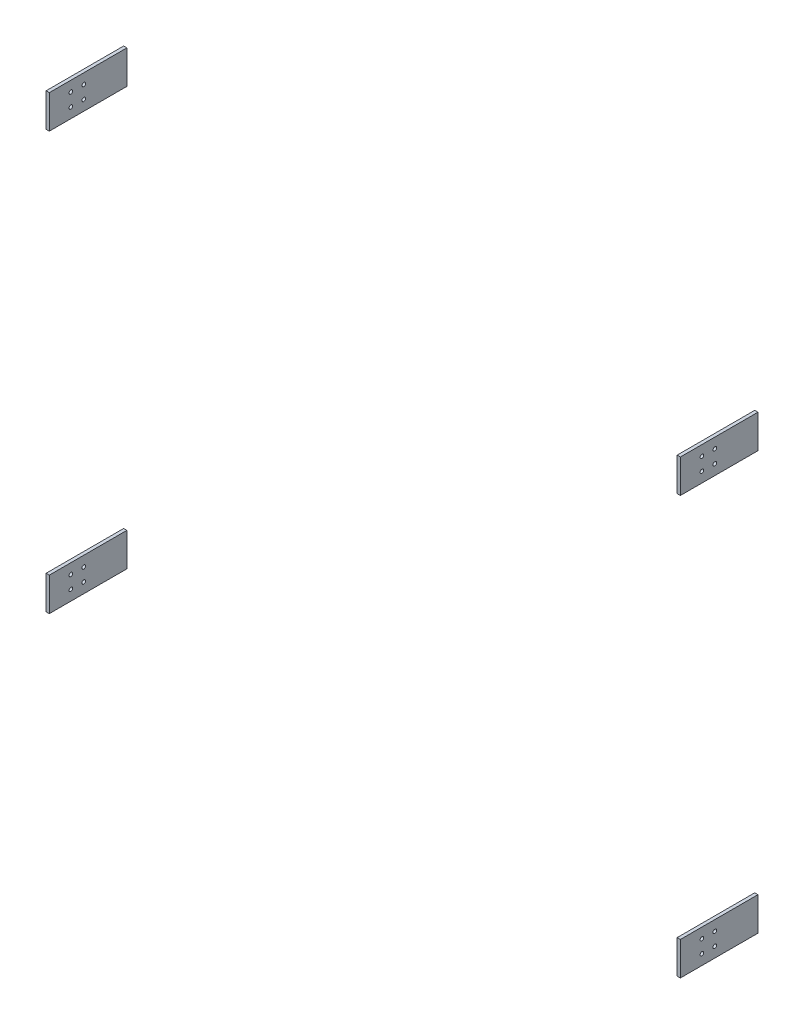
ISO-10303-21;
HEADER;
FILE_DESCRIPTION(('STEP AP214'),'2;1');
FILE_NAME('part.step','',(''),(''),'','','');
FILE_SCHEMA(('AUTOMOTIVE_DESIGN { 1 0 10303 214 1 1 1 1 }'));
ENDSEC;
DATA;
#1=APPLICATION_CONTEXT('core data for automotive mechanical design processes');
#2=APPLICATION_PROTOCOL_DEFINITION('international standard','automotive_design',2000,#1);
#3=PRODUCT_CONTEXT('',#1,'mechanical');
#4=PRODUCT('Part','Part','',(#3));
#5=PRODUCT_RELATED_PRODUCT_CATEGORY('part','',(#4));
#6=PRODUCT_DEFINITION_FORMATION('','',#4);
#7=PRODUCT_DEFINITION_CONTEXT('part definition',#1,'design');
#8=PRODUCT_DEFINITION('design','',#6,#7);
#9=PRODUCT_DEFINITION_SHAPE('','',#8);
#10=(LENGTH_UNIT() NAMED_UNIT(*) SI_UNIT(.MILLI.,.METRE.));
#11=(NAMED_UNIT(*) PLANE_ANGLE_UNIT() SI_UNIT($,.RADIAN.));
#12=(NAMED_UNIT(*) SI_UNIT($,.STERADIAN.) SOLID_ANGLE_UNIT());
#13=UNCERTAINTY_MEASURE_WITH_UNIT(LENGTH_MEASURE(1.E-05),#10,'distance_accuracy_value','');
#14=(GEOMETRIC_REPRESENTATION_CONTEXT(3) GLOBAL_UNCERTAINTY_ASSIGNED_CONTEXT((#13)) GLOBAL_UNIT_ASSIGNED_CONTEXT((#10,
#11,#12)) REPRESENTATION_CONTEXT('',''));
#15=CARTESIAN_POINT('',(0.,0.,0.));
#16=DIRECTION('',(0.,0.,1.));
#17=DIRECTION('',(1.,0.,0.));
#18=AXIS2_PLACEMENT_3D('',#15,#16,#17);
#19=CARTESIAN_POINT('',(-293.,-194.,14.));
#20=DIRECTION('',(0.,0.,1.));
#21=DIRECTION('',(1.,0.,0.));
#22=AXIS2_PLACEMENT_3D('',#19,#20,#21);
#23=PLANE('',#22);
#24=DIRECTION('',(-1.,0.,0.));
#25=VECTOR('',#24,1.);
#26=CARTESIAN_POINT('',(-293.,-209.5,14.));
#27=LINE('',#26,#25);
#28=CARTESIAN_POINT('',(-291.5,-209.5,14.));
#29=VERTEX_POINT('',#28);
#30=CARTESIAN_POINT('',(-294.5,-209.5,14.));
#31=VERTEX_POINT('',#30);
#32=EDGE_CURVE('P0_E11',#29,#31,#27,.T.);
#33=ORIENTED_EDGE('',*,*,#32,.F.);
#34=DIRECTION('',(0.,-1.,0.));
#35=VECTOR('',#34,1.);
#36=CARTESIAN_POINT('',(-291.5,-194.,14.));
#37=LINE('',#36,#35);
#38=CARTESIAN_POINT('',(-291.5,-178.5,14.));
#39=VERTEX_POINT('',#38);
#40=EDGE_CURVE('P0_E64',#39,#29,#37,.T.);
#41=ORIENTED_EDGE('',*,*,#40,.F.);
#42=DIRECTION('',(1.,0.,0.));
#43=VECTOR('',#42,1.);
#44=CARTESIAN_POINT('',(-293.,-178.5,14.));
#45=LINE('',#44,#43);
#46=CARTESIAN_POINT('',(-294.5,-178.5,14.));
#47=VERTEX_POINT('',#46);
#48=EDGE_CURVE('P0_E104',#47,#39,#45,.T.);
#49=ORIENTED_EDGE('',*,*,#48,.F.);
#50=DIRECTION('',(0.,1.,0.));
#51=VECTOR('',#50,1.);
#52=CARTESIAN_POINT('',(-294.5,-194.,14.));
#53=LINE('',#52,#51);
#54=EDGE_CURVE('P0_E26',#31,#47,#53,.T.);
#55=ORIENTED_EDGE('',*,*,#54,.F.);
#56=EDGE_LOOP('',(#33,#41,#49,#55));
#57=FACE_BOUND('',#56,.T.);
#58=ADVANCED_FACE('P0_F17',(#57),#23,.T.);
#59=CARTESIAN_POINT('',(-293.,-209.5,-58.));
#60=DIRECTION('',(0.,-1.,0.));
#61=DIRECTION('',(0.,0.,-1.));
#62=AXIS2_PLACEMENT_3D('',#59,#60,#61);
#63=PLANE('',#62);
#64=DIRECTION('',(0.,0.,1.));
#65=VECTOR('',#64,1.);
#66=CARTESIAN_POINT('',(-291.5,-209.5,-58.));
#67=LINE('',#66,#65);
#68=CARTESIAN_POINT('',(-291.5,-209.5,-58.));
#69=VERTEX_POINT('',#68);
#70=EDGE_CURVE('P0_E57',#69,#29,#67,.T.);
#71=ORIENTED_EDGE('',*,*,#70,.T.);
#72=ORIENTED_EDGE('',*,*,#32,.T.);
#73=DIRECTION('',(0.,0.,1.));
#74=VECTOR('',#73,1.);
#75=CARTESIAN_POINT('',(-294.5,-209.5,-58.));
#76=LINE('',#75,#74);
#77=CARTESIAN_POINT('',(-294.5,-209.5,-58.));
#78=VERTEX_POINT('',#77);
#79=EDGE_CURVE('P0_E71',#78,#31,#76,.T.);
#80=ORIENTED_EDGE('',*,*,#79,.F.);
#81=DIRECTION('',(1.,0.,0.));
#82=VECTOR('',#81,1.);
#83=CARTESIAN_POINT('',(-293.,-209.5,-58.));
#84=LINE('',#83,#82);
#85=EDGE_CURVE('P0_E69',#78,#69,#84,.T.);
#86=ORIENTED_EDGE('',*,*,#85,.T.);
#87=EDGE_LOOP('',(#71,#72,#80,#86));
#88=FACE_BOUND('',#87,.T.);
#89=ADVANCED_FACE('P0_F70',(#88),#63,.T.);
#90=CARTESIAN_POINT('',(-294.5,-194.,-58.));
#91=DIRECTION('',(-1.,0.,0.));
#92=DIRECTION('',(0.,0.,1.));
#93=AXIS2_PLACEMENT_3D('',#90,#91,#92);
#94=PLANE('',#93);
#95=CARTESIAN_POINT('',(-294.5,-188.,-6.));
#96=DIRECTION('',(-1.,0.,0.));
#97=DIRECTION('',(0.,0.,1.));
#98=AXIS2_PLACEMENT_3D('',#95,#96,#97);
#99=CIRCLE('',#98,1.7);
#100=CARTESIAN_POINT('',(-294.5,-188.,-4.3));
#101=VERTEX_POINT('',#100);
#102=EDGE_CURVE('P0_E121',#101,#101,#99,.T.);
#103=ORIENTED_EDGE('',*,*,#102,.F.);
#104=EDGE_LOOP('',(#103));
#105=FACE_BOUND('',#104,.T.);
#106=CARTESIAN_POINT('',(-294.5,-188.,-18.));
#107=DIRECTION('',(-1.,0.,0.));
#108=DIRECTION('',(0.,0.,1.));
#109=AXIS2_PLACEMENT_3D('',#106,#107,#108);
#110=CIRCLE('',#109,1.7);
#111=CARTESIAN_POINT('',(-294.5,-188.,-16.3));
#112=VERTEX_POINT('',#111);
#113=EDGE_CURVE('P0_E117',#112,#112,#110,.T.);
#114=ORIENTED_EDGE('',*,*,#113,.F.);
#115=EDGE_LOOP('',(#114));
#116=FACE_BOUND('',#115,.T.);
#117=CARTESIAN_POINT('',(-294.5,-200.,-6.));
#118=DIRECTION('',(-1.,0.,0.));
#119=DIRECTION('',(0.,0.,1.));
#120=AXIS2_PLACEMENT_3D('',#117,#118,#119);
#121=CIRCLE('',#120,1.7);
#122=CARTESIAN_POINT('',(-294.5,-200.,-4.3));
#123=VERTEX_POINT('',#122);
#124=EDGE_CURVE('P0_E113',#123,#123,#121,.T.);
#125=ORIENTED_EDGE('',*,*,#124,.F.);
#126=EDGE_LOOP('',(#125));
#127=FACE_BOUND('',#126,.T.);
#128=CARTESIAN_POINT('',(-294.5,-200.,-18.));
#129=DIRECTION('',(-1.,0.,0.));
#130=DIRECTION('',(0.,0.,1.));
#131=AXIS2_PLACEMENT_3D('',#128,#129,#130);
#132=CIRCLE('',#131,1.7);
#133=CARTESIAN_POINT('',(-294.5,-200.,-16.3));
#134=VERTEX_POINT('',#133);
#135=EDGE_CURVE('P0_E77',#134,#134,#132,.T.);
#136=ORIENTED_EDGE('',*,*,#135,.F.);
#137=EDGE_LOOP('',(#136));
#138=FACE_BOUND('',#137,.T.);
#139=ORIENTED_EDGE('',*,*,#79,.T.);
#140=ORIENTED_EDGE('',*,*,#54,.T.);
#141=DIRECTION('',(0.,0.,1.));
#142=VECTOR('',#141,1.);
#143=CARTESIAN_POINT('',(-294.5,-178.5,-58.));
#144=LINE('',#143,#142);
#145=CARTESIAN_POINT('',(-294.5,-178.5,-58.));
#146=VERTEX_POINT('',#145);
#147=EDGE_CURVE('P0_E96',#146,#47,#144,.T.);
#148=ORIENTED_EDGE('',*,*,#147,.F.);
#149=DIRECTION('',(0.,-1.,0.));
#150=VECTOR('',#149,1.);
#151=CARTESIAN_POINT('',(-294.5,-194.,-58.));
#152=LINE('',#151,#150);
#153=EDGE_CURVE('P0_E76',#146,#78,#152,.T.);
#154=ORIENTED_EDGE('',*,*,#153,.T.);
#155=EDGE_LOOP('',(#139,#140,#148,#154));
#156=FACE_BOUND('',#155,.T.);
#157=ADVANCED_FACE('P0_F142',(#105,#116,#127,#138,#156),#94,.T.);
#158=CARTESIAN_POINT('',(-293.,-178.5,-58.));
#159=DIRECTION('',(0.,1.,0.));
#160=DIRECTION('',(0.,0.,1.));
#161=AXIS2_PLACEMENT_3D('',#158,#159,#160);
#162=PLANE('',#161);
#163=ORIENTED_EDGE('',*,*,#147,.T.);
#164=ORIENTED_EDGE('',*,*,#48,.T.);
#165=DIRECTION('',(0.,0.,1.));
#166=VECTOR('',#165,1.);
#167=CARTESIAN_POINT('',(-291.5,-178.5,-58.));
#168=LINE('',#167,#166);
#169=CARTESIAN_POINT('',(-291.5,-178.5,-58.));
#170=VERTEX_POINT('',#169);
#171=EDGE_CURVE('P0_E66',#170,#39,#168,.T.);
#172=ORIENTED_EDGE('',*,*,#171,.F.);
#173=DIRECTION('',(-1.,0.,0.));
#174=VECTOR('',#173,1.);
#175=CARTESIAN_POINT('',(-293.,-178.5,-58.));
#176=LINE('',#175,#174);
#177=EDGE_CURVE('P0_E82',#170,#146,#176,.T.);
#178=ORIENTED_EDGE('',*,*,#177,.T.);
#179=EDGE_LOOP('',(#163,#164,#172,#178));
#180=FACE_BOUND('',#179,.T.);
#181=ADVANCED_FACE('P0_F144',(#180),#162,.T.);
#182=CARTESIAN_POINT('',(-293.,-194.,-58.));
#183=DIRECTION('',(0.,0.,-1.));
#184=DIRECTION('',(-1.,0.,0.));
#185=AXIS2_PLACEMENT_3D('',#182,#183,#184);
#186=PLANE('',#185);
#187=DIRECTION('',(0.,1.,0.));
#188=VECTOR('',#187,1.);
#189=CARTESIAN_POINT('',(-291.5,-194.,-58.));
#190=LINE('',#189,#188);
#191=EDGE_CURVE('P0_E62',#69,#170,#190,.T.);
#192=ORIENTED_EDGE('',*,*,#191,.F.);
#193=ORIENTED_EDGE('',*,*,#85,.F.);
#194=ORIENTED_EDGE('',*,*,#153,.F.);
#195=ORIENTED_EDGE('',*,*,#177,.F.);
#196=EDGE_LOOP('',(#192,#193,#194,#195));
#197=FACE_BOUND('',#196,.T.);
#198=ADVANCED_FACE('P0_F80',(#197),#186,.T.);
#199=CARTESIAN_POINT('',(-291.5,-194.,-58.));
#200=DIRECTION('',(1.,0.,0.));
#201=DIRECTION('',(0.,0.,-1.));
#202=AXIS2_PLACEMENT_3D('',#199,#200,#201);
#203=PLANE('',#202);
#204=CARTESIAN_POINT('',(-291.5,-188.,-6.));
#205=DIRECTION('',(1.,0.,0.));
#206=DIRECTION('',(0.,0.,-1.));
#207=AXIS2_PLACEMENT_3D('',#204,#205,#206);
#208=CIRCLE('',#207,1.7);
#209=CARTESIAN_POINT('',(-291.5,-188.,-7.7));
#210=VERTEX_POINT('',#209);
#211=EDGE_CURVE('P0_E20',#210,#210,#208,.T.);
#212=ORIENTED_EDGE('',*,*,#211,.F.);
#213=EDGE_LOOP('',(#212));
#214=FACE_BOUND('',#213,.T.);
#215=CARTESIAN_POINT('',(-291.5,-188.,-18.));
#216=DIRECTION('',(1.,0.,0.));
#217=DIRECTION('',(0.,0.,-1.));
#218=AXIS2_PLACEMENT_3D('',#215,#216,#217);
#219=CIRCLE('',#218,1.7);
#220=CARTESIAN_POINT('',(-291.5,-188.,-19.7));
#221=VERTEX_POINT('',#220);
#222=EDGE_CURVE('P0_E118',#221,#221,#219,.T.);
#223=ORIENTED_EDGE('',*,*,#222,.F.);
#224=EDGE_LOOP('',(#223));
#225=FACE_BOUND('',#224,.T.);
#226=CARTESIAN_POINT('',(-291.5,-200.,-6.));
#227=DIRECTION('',(1.,0.,0.));
#228=DIRECTION('',(0.,0.,-1.));
#229=AXIS2_PLACEMENT_3D('',#226,#227,#228);
#230=CIRCLE('',#229,1.7);
#231=CARTESIAN_POINT('',(-291.5,-200.,-7.7));
#232=VERTEX_POINT('',#231);
#233=EDGE_CURVE('P0_E114',#232,#232,#230,.T.);
#234=ORIENTED_EDGE('',*,*,#233,.F.);
#235=EDGE_LOOP('',(#234));
#236=FACE_BOUND('',#235,.T.);
#237=CARTESIAN_POINT('',(-291.5,-200.,-18.));
#238=DIRECTION('',(1.,0.,0.));
#239=DIRECTION('',(0.,0.,-1.));
#240=AXIS2_PLACEMENT_3D('',#237,#238,#239);
#241=CIRCLE('',#240,1.7);
#242=CARTESIAN_POINT('',(-291.5,-200.,-19.7));
#243=VERTEX_POINT('',#242);
#244=EDGE_CURVE('P0_E109',#243,#243,#241,.T.);
#245=ORIENTED_EDGE('',*,*,#244,.F.);
#246=EDGE_LOOP('',(#245));
#247=FACE_BOUND('',#246,.T.);
#248=ORIENTED_EDGE('',*,*,#191,.T.);
#249=ORIENTED_EDGE('',*,*,#171,.T.);
#250=ORIENTED_EDGE('',*,*,#40,.T.);
#251=ORIENTED_EDGE('',*,*,#70,.F.);
#252=EDGE_LOOP('',(#248,#249,#250,#251));
#253=FACE_BOUND('',#252,.T.);
#254=ADVANCED_FACE('P0_F59',(#214,#225,#236,#247,#253),#203,.T.);
#255=CARTESIAN_POINT('',(-291.2,-200.,-18.));
#256=DIRECTION('',(-1.,0.,0.));
#257=DIRECTION('',(0.,0.,1.));
#258=AXIS2_PLACEMENT_3D('',#255,#256,#257);
#259=CYLINDRICAL_SURFACE('',#258,1.7);
#260=ORIENTED_EDGE('',*,*,#135,.T.);
#261=EDGE_LOOP('',(#260));
#262=FACE_BOUND('',#261,.T.);
#263=ORIENTED_EDGE('',*,*,#244,.T.);
#264=EDGE_LOOP('',(#263));
#265=FACE_BOUND('',#264,.T.);
#266=ADVANCED_FACE('P0_F139',(#262,#265),#259,.F.);
#267=CARTESIAN_POINT('',(-291.2,-200.,-6.));
#268=DIRECTION('',(-1.,0.,0.));
#269=DIRECTION('',(0.,0.,1.));
#270=AXIS2_PLACEMENT_3D('',#267,#268,#269);
#271=CYLINDRICAL_SURFACE('',#270,1.7);
#272=ORIENTED_EDGE('',*,*,#124,.T.);
#273=EDGE_LOOP('',(#272));
#274=FACE_BOUND('',#273,.T.);
#275=ORIENTED_EDGE('',*,*,#233,.T.);
#276=EDGE_LOOP('',(#275));
#277=FACE_BOUND('',#276,.T.);
#278=ADVANCED_FACE('P0_F164',(#274,#277),#271,.F.);
#279=CARTESIAN_POINT('',(-291.2,-188.,-18.));
#280=DIRECTION('',(-1.,0.,0.));
#281=DIRECTION('',(0.,0.,1.));
#282=AXIS2_PLACEMENT_3D('',#279,#280,#281);
#283=CYLINDRICAL_SURFACE('',#282,1.7);
#284=ORIENTED_EDGE('',*,*,#113,.T.);
#285=EDGE_LOOP('',(#284));
#286=FACE_BOUND('',#285,.T.);
#287=ORIENTED_EDGE('',*,*,#222,.T.);
#288=EDGE_LOOP('',(#287));
#289=FACE_BOUND('',#288,.T.);
#290=ADVANCED_FACE('P0_F167',(#286,#289),#283,.F.);
#291=CARTESIAN_POINT('',(-291.2,-188.,-6.));
#292=DIRECTION('',(-1.,0.,0.));
#293=DIRECTION('',(0.,0.,1.));
#294=AXIS2_PLACEMENT_3D('',#291,#292,#293);
#295=CYLINDRICAL_SURFACE('',#294,1.7);
#296=ORIENTED_EDGE('',*,*,#102,.T.);
#297=EDGE_LOOP('',(#296));
#298=FACE_BOUND('',#297,.T.);
#299=ORIENTED_EDGE('',*,*,#211,.T.);
#300=EDGE_LOOP('',(#299));
#301=FACE_BOUND('',#300,.T.);
#302=ADVANCED_FACE('P0_F171',(#298,#301),#295,.F.);
#303=CLOSED_SHELL('',(#58,#89,#157,#181,#198,#254,#266,#278,#290,#302));
#304=MANIFOLD_SOLID_BREP('P0_B1',#303);
#305=CARTESIAN_POINT('',(-293.,194.,14.));
#306=DIRECTION('',(0.,0.,1.));
#307=DIRECTION('',(1.,0.,0.));
#308=AXIS2_PLACEMENT_3D('',#305,#306,#307);
#309=PLANE('',#308);
#310=DIRECTION('',(-1.,0.,0.));
#311=VECTOR('',#310,1.);
#312=CARTESIAN_POINT('',(-293.,178.5,14.));
#313=LINE('',#312,#311);
#314=CARTESIAN_POINT('',(-291.5,178.5,14.));
#315=VERTEX_POINT('',#314);
#316=CARTESIAN_POINT('',(-294.5,178.5,14.));
#317=VERTEX_POINT('',#316);
#318=EDGE_CURVE('P1_E11',#315,#317,#313,.T.);
#319=ORIENTED_EDGE('',*,*,#318,.F.);
#320=DIRECTION('',(0.,-1.,0.));
#321=VECTOR('',#320,1.);
#322=CARTESIAN_POINT('',(-291.5,194.,14.));
#323=LINE('',#322,#321);
#324=CARTESIAN_POINT('',(-291.5,209.5,14.));
#325=VERTEX_POINT('',#324);
#326=EDGE_CURVE('P1_E64',#325,#315,#323,.T.);
#327=ORIENTED_EDGE('',*,*,#326,.F.);
#328=DIRECTION('',(1.,0.,0.));
#329=VECTOR('',#328,1.);
#330=CARTESIAN_POINT('',(-293.,209.5,14.));
#331=LINE('',#330,#329);
#332=CARTESIAN_POINT('',(-294.5,209.5,14.));
#333=VERTEX_POINT('',#332);
#334=EDGE_CURVE('P1_E103',#333,#325,#331,.T.);
#335=ORIENTED_EDGE('',*,*,#334,.F.);
#336=DIRECTION('',(0.,1.,0.));
#337=VECTOR('',#336,1.);
#338=CARTESIAN_POINT('',(-294.5,194.,14.));
#339=LINE('',#338,#337);
#340=EDGE_CURVE('P1_E26',#317,#333,#339,.T.);
#341=ORIENTED_EDGE('',*,*,#340,.F.);
#342=EDGE_LOOP('',(#319,#327,#335,#341));
#343=FACE_BOUND('',#342,.T.);
#344=ADVANCED_FACE('P1_F17',(#343),#309,.T.);
#345=CARTESIAN_POINT('',(-293.,178.5,-58.));
#346=DIRECTION('',(0.,-1.,0.));
#347=DIRECTION('',(0.,0.,-1.));
#348=AXIS2_PLACEMENT_3D('',#345,#346,#347);
#349=PLANE('',#348);
#350=DIRECTION('',(0.,0.,1.));
#351=VECTOR('',#350,1.);
#352=CARTESIAN_POINT('',(-291.5,178.5,-58.));
#353=LINE('',#352,#351);
#354=CARTESIAN_POINT('',(-291.5,178.5,-58.));
#355=VERTEX_POINT('',#354);
#356=EDGE_CURVE('P1_E57',#355,#315,#353,.T.);
#357=ORIENTED_EDGE('',*,*,#356,.T.);
#358=ORIENTED_EDGE('',*,*,#318,.T.);
#359=DIRECTION('',(0.,0.,1.));
#360=VECTOR('',#359,1.);
#361=CARTESIAN_POINT('',(-294.5,178.5,-58.));
#362=LINE('',#361,#360);
#363=CARTESIAN_POINT('',(-294.5,178.5,-58.));
#364=VERTEX_POINT('',#363);
#365=EDGE_CURVE('P1_E71',#364,#317,#362,.T.);
#366=ORIENTED_EDGE('',*,*,#365,.F.);
#367=DIRECTION('',(1.,0.,0.));
#368=VECTOR('',#367,1.);
#369=CARTESIAN_POINT('',(-293.,178.5,-58.));
#370=LINE('',#369,#368);
#371=EDGE_CURVE('P1_E69',#364,#355,#370,.T.);
#372=ORIENTED_EDGE('',*,*,#371,.T.);
#373=EDGE_LOOP('',(#357,#358,#366,#372));
#374=FACE_BOUND('',#373,.T.);
#375=ADVANCED_FACE('P1_F70',(#374),#349,.T.);
#376=CARTESIAN_POINT('',(-294.5,194.,-58.));
#377=DIRECTION('',(-1.,0.,0.));
#378=DIRECTION('',(0.,0.,1.));
#379=AXIS2_PLACEMENT_3D('',#376,#377,#378);
#380=PLANE('',#379);
#381=CARTESIAN_POINT('',(-294.5,200.,-6.));
#382=DIRECTION('',(-1.,0.,0.));
#383=DIRECTION('',(0.,0.,1.));
#384=AXIS2_PLACEMENT_3D('',#381,#382,#383);
#385=CIRCLE('',#384,1.7);
#386=CARTESIAN_POINT('',(-294.5,200.,-4.3));
#387=VERTEX_POINT('',#386);
#388=EDGE_CURVE('P1_E119',#387,#387,#385,.T.);
#389=ORIENTED_EDGE('',*,*,#388,.F.);
#390=EDGE_LOOP('',(#389));
#391=FACE_BOUND('',#390,.T.);
#392=CARTESIAN_POINT('',(-294.5,200.,-18.));
#393=DIRECTION('',(-1.,0.,0.));
#394=DIRECTION('',(0.,0.,1.));
#395=AXIS2_PLACEMENT_3D('',#392,#393,#394);
#396=CIRCLE('',#395,1.7);
#397=CARTESIAN_POINT('',(-294.5,200.,-16.3));
#398=VERTEX_POINT('',#397);
#399=EDGE_CURVE('P1_E115',#398,#398,#396,.T.);
#400=ORIENTED_EDGE('',*,*,#399,.F.);
#401=EDGE_LOOP('',(#400));
#402=FACE_BOUND('',#401,.T.);
#403=CARTESIAN_POINT('',(-294.5,188.,-6.));
#404=DIRECTION('',(-1.,0.,0.));
#405=DIRECTION('',(0.,0.,1.));
#406=AXIS2_PLACEMENT_3D('',#403,#404,#405);
#407=CIRCLE('',#406,1.7);
#408=CARTESIAN_POINT('',(-294.5,188.,-4.3));
#409=VERTEX_POINT('',#408);
#410=EDGE_CURVE('P1_E111',#409,#409,#407,.T.);
#411=ORIENTED_EDGE('',*,*,#410,.F.);
#412=EDGE_LOOP('',(#411));
#413=FACE_BOUND('',#412,.T.);
#414=CARTESIAN_POINT('',(-294.5,188.,-18.));
#415=DIRECTION('',(-1.,0.,0.));
#416=DIRECTION('',(0.,0.,1.));
#417=AXIS2_PLACEMENT_3D('',#414,#415,#416);
#418=CIRCLE('',#417,1.7);
#419=CARTESIAN_POINT('',(-294.5,188.,-16.3));
#420=VERTEX_POINT('',#419);
#421=EDGE_CURVE('P1_E77',#420,#420,#418,.T.);
#422=ORIENTED_EDGE('',*,*,#421,.F.);
#423=EDGE_LOOP('',(#422));
#424=FACE_BOUND('',#423,.T.);
#425=ORIENTED_EDGE('',*,*,#365,.T.);
#426=ORIENTED_EDGE('',*,*,#340,.T.);
#427=DIRECTION('',(0.,0.,1.));
#428=VECTOR('',#427,1.);
#429=CARTESIAN_POINT('',(-294.5,209.5,-58.));
#430=LINE('',#429,#428);
#431=CARTESIAN_POINT('',(-294.5,209.5,-58.));
#432=VERTEX_POINT('',#431);
#433=EDGE_CURVE('P1_E96',#432,#333,#430,.T.);
#434=ORIENTED_EDGE('',*,*,#433,.F.);
#435=DIRECTION('',(0.,-1.,0.));
#436=VECTOR('',#435,1.);
#437=CARTESIAN_POINT('',(-294.5,194.,-58.));
#438=LINE('',#437,#436);
#439=EDGE_CURVE('P1_E76',#432,#364,#438,.T.);
#440=ORIENTED_EDGE('',*,*,#439,.T.);
#441=EDGE_LOOP('',(#425,#426,#434,#440));
#442=FACE_BOUND('',#441,.T.);
#443=ADVANCED_FACE('P1_F142',(#391,#402,#413,#424,#442),#380,.T.);
#444=CARTESIAN_POINT('',(-293.,209.5,-58.));
#445=DIRECTION('',(0.,1.,0.));
#446=DIRECTION('',(0.,0.,1.));
#447=AXIS2_PLACEMENT_3D('',#444,#445,#446);
#448=PLANE('',#447);
#449=ORIENTED_EDGE('',*,*,#433,.T.);
#450=ORIENTED_EDGE('',*,*,#334,.T.);
#451=DIRECTION('',(0.,0.,1.));
#452=VECTOR('',#451,1.);
#453=CARTESIAN_POINT('',(-291.5,209.5,-58.));
#454=LINE('',#453,#452);
#455=CARTESIAN_POINT('',(-291.5,209.5,-58.));
#456=VERTEX_POINT('',#455);
#457=EDGE_CURVE('P1_E66',#456,#325,#454,.T.);
#458=ORIENTED_EDGE('',*,*,#457,.F.);
#459=DIRECTION('',(-1.,0.,0.));
#460=VECTOR('',#459,1.);
#461=CARTESIAN_POINT('',(-293.,209.5,-58.));
#462=LINE('',#461,#460);
#463=EDGE_CURVE('P1_E82',#456,#432,#462,.T.);
#464=ORIENTED_EDGE('',*,*,#463,.T.);
#465=EDGE_LOOP('',(#449,#450,#458,#464));
#466=FACE_BOUND('',#465,.T.);
#467=ADVANCED_FACE('P1_F144',(#466),#448,.T.);
#468=CARTESIAN_POINT('',(-293.,194.,-58.));
#469=DIRECTION('',(0.,0.,-1.));
#470=DIRECTION('',(-1.,0.,0.));
#471=AXIS2_PLACEMENT_3D('',#468,#469,#470);
#472=PLANE('',#471);
#473=DIRECTION('',(0.,1.,0.));
#474=VECTOR('',#473,1.);
#475=CARTESIAN_POINT('',(-291.5,194.,-58.));
#476=LINE('',#475,#474);
#477=EDGE_CURVE('P1_E62',#355,#456,#476,.T.);
#478=ORIENTED_EDGE('',*,*,#477,.F.);
#479=ORIENTED_EDGE('',*,*,#371,.F.);
#480=ORIENTED_EDGE('',*,*,#439,.F.);
#481=ORIENTED_EDGE('',*,*,#463,.F.);
#482=EDGE_LOOP('',(#478,#479,#480,#481));
#483=FACE_BOUND('',#482,.T.);
#484=ADVANCED_FACE('P1_F80',(#483),#472,.T.);
#485=CARTESIAN_POINT('',(-291.5,194.,-58.));
#486=DIRECTION('',(1.,0.,0.));
#487=DIRECTION('',(0.,0.,-1.));
#488=AXIS2_PLACEMENT_3D('',#485,#486,#487);
#489=PLANE('',#488);
#490=CARTESIAN_POINT('',(-291.5,200.,-6.));
#491=DIRECTION('',(1.,0.,0.));
#492=DIRECTION('',(0.,0.,-1.));
#493=AXIS2_PLACEMENT_3D('',#490,#491,#492);
#494=CIRCLE('',#493,1.7);
#495=CARTESIAN_POINT('',(-291.5,200.,-7.7));
#496=VERTEX_POINT('',#495);
#497=EDGE_CURVE('P1_E20',#496,#496,#494,.T.);
#498=ORIENTED_EDGE('',*,*,#497,.F.);
#499=EDGE_LOOP('',(#498));
#500=FACE_BOUND('',#499,.T.);
#501=CARTESIAN_POINT('',(-291.5,200.,-18.));
#502=DIRECTION('',(1.,0.,0.));
#503=DIRECTION('',(0.,0.,-1.));
#504=AXIS2_PLACEMENT_3D('',#501,#502,#503);
#505=CIRCLE('',#504,1.7);
#506=CARTESIAN_POINT('',(-291.5,200.,-19.7));
#507=VERTEX_POINT('',#506);
#508=EDGE_CURVE('P1_E116',#507,#507,#505,.T.);
#509=ORIENTED_EDGE('',*,*,#508,.F.);
#510=EDGE_LOOP('',(#509));
#511=FACE_BOUND('',#510,.T.);
#512=CARTESIAN_POINT('',(-291.5,188.,-6.));
#513=DIRECTION('',(1.,0.,0.));
#514=DIRECTION('',(0.,0.,-1.));
#515=AXIS2_PLACEMENT_3D('',#512,#513,#514);
#516=CIRCLE('',#515,1.7);
#517=CARTESIAN_POINT('',(-291.5,188.,-7.7));
#518=VERTEX_POINT('',#517);
#519=EDGE_CURVE('P1_E112',#518,#518,#516,.T.);
#520=ORIENTED_EDGE('',*,*,#519,.F.);
#521=EDGE_LOOP('',(#520));
#522=FACE_BOUND('',#521,.T.);
#523=CARTESIAN_POINT('',(-291.5,188.,-18.));
#524=DIRECTION('',(1.,0.,0.));
#525=DIRECTION('',(0.,0.,-1.));
#526=AXIS2_PLACEMENT_3D('',#523,#524,#525);
#527=CIRCLE('',#526,1.7);
#528=CARTESIAN_POINT('',(-291.5,188.,-19.7));
#529=VERTEX_POINT('',#528);
#530=EDGE_CURVE('P1_E107',#529,#529,#527,.T.);
#531=ORIENTED_EDGE('',*,*,#530,.F.);
#532=EDGE_LOOP('',(#531));
#533=FACE_BOUND('',#532,.T.);
#534=ORIENTED_EDGE('',*,*,#477,.T.);
#535=ORIENTED_EDGE('',*,*,#457,.T.);
#536=ORIENTED_EDGE('',*,*,#326,.T.);
#537=ORIENTED_EDGE('',*,*,#356,.F.);
#538=EDGE_LOOP('',(#534,#535,#536,#537));
#539=FACE_BOUND('',#538,.T.);
#540=ADVANCED_FACE('P1_F59',(#500,#511,#522,#533,#539),#489,.T.);
#541=CARTESIAN_POINT('',(-291.2,188.,-18.));
#542=DIRECTION('',(-1.,0.,0.));
#543=DIRECTION('',(0.,0.,1.));
#544=AXIS2_PLACEMENT_3D('',#541,#542,#543);
#545=CYLINDRICAL_SURFACE('',#544,1.7);
#546=ORIENTED_EDGE('',*,*,#421,.T.);
#547=EDGE_LOOP('',(#546));
#548=FACE_BOUND('',#547,.T.);
#549=ORIENTED_EDGE('',*,*,#530,.T.);
#550=EDGE_LOOP('',(#549));
#551=FACE_BOUND('',#550,.T.);
#552=ADVANCED_FACE('P1_F139',(#548,#551),#545,.F.);
#553=CARTESIAN_POINT('',(-291.2,188.,-6.));
#554=DIRECTION('',(-1.,0.,0.));
#555=DIRECTION('',(0.,0.,1.));
#556=AXIS2_PLACEMENT_3D('',#553,#554,#555);
#557=CYLINDRICAL_SURFACE('',#556,1.7);
#558=ORIENTED_EDGE('',*,*,#410,.T.);
#559=EDGE_LOOP('',(#558));
#560=FACE_BOUND('',#559,.T.);
#561=ORIENTED_EDGE('',*,*,#519,.T.);
#562=EDGE_LOOP('',(#561));
#563=FACE_BOUND('',#562,.T.);
#564=ADVANCED_FACE('P1_F164',(#560,#563),#557,.F.);
#565=CARTESIAN_POINT('',(-291.2,200.,-18.));
#566=DIRECTION('',(-1.,0.,0.));
#567=DIRECTION('',(0.,0.,1.));
#568=AXIS2_PLACEMENT_3D('',#565,#566,#567);
#569=CYLINDRICAL_SURFACE('',#568,1.7);
#570=ORIENTED_EDGE('',*,*,#399,.T.);
#571=EDGE_LOOP('',(#570));
#572=FACE_BOUND('',#571,.T.);
#573=ORIENTED_EDGE('',*,*,#508,.T.);
#574=EDGE_LOOP('',(#573));
#575=FACE_BOUND('',#574,.T.);
#576=ADVANCED_FACE('P1_F167',(#572,#575),#569,.F.);
#577=CARTESIAN_POINT('',(-291.2,200.,-6.));
#578=DIRECTION('',(-1.,0.,0.));
#579=DIRECTION('',(0.,0.,1.));
#580=AXIS2_PLACEMENT_3D('',#577,#578,#579);
#581=CYLINDRICAL_SURFACE('',#580,1.7);
#582=ORIENTED_EDGE('',*,*,#388,.T.);
#583=EDGE_LOOP('',(#582));
#584=FACE_BOUND('',#583,.T.);
#585=ORIENTED_EDGE('',*,*,#497,.T.);
#586=EDGE_LOOP('',(#585));
#587=FACE_BOUND('',#586,.T.);
#588=ADVANCED_FACE('P1_F171',(#584,#587),#581,.F.);
#589=CLOSED_SHELL('',(#344,#375,#443,#467,#484,#540,#552,#564,#576,#588));
#590=MANIFOLD_SOLID_BREP('P1_B1',#589);
#591=CARTESIAN_POINT('',(293.,-194.,14.));
#592=DIRECTION('',(0.,0.,1.));
#593=DIRECTION('',(1.,0.,0.));
#594=AXIS2_PLACEMENT_3D('',#591,#592,#593);
#595=PLANE('',#594);
#596=DIRECTION('',(-1.,0.,0.));
#597=VECTOR('',#596,1.);
#598=CARTESIAN_POINT('',(293.,-209.5,14.));
#599=LINE('',#598,#597);
#600=CARTESIAN_POINT('',(294.5,-209.5,14.));
#601=VERTEX_POINT('',#600);
#602=CARTESIAN_POINT('',(291.5,-209.5,14.));
#603=VERTEX_POINT('',#602);
#604=EDGE_CURVE('P2_E11',#601,#603,#599,.T.);
#605=ORIENTED_EDGE('',*,*,#604,.F.);
#606=DIRECTION('',(0.,-1.,0.));
#607=VECTOR('',#606,1.);
#608=CARTESIAN_POINT('',(294.5,-194.,14.));
#609=LINE('',#608,#607);
#610=CARTESIAN_POINT('',(294.5,-178.5,14.));
#611=VERTEX_POINT('',#610);
#612=EDGE_CURVE('P2_E64',#611,#601,#609,.T.);
#613=ORIENTED_EDGE('',*,*,#612,.F.);
#614=DIRECTION('',(1.,0.,0.));
#615=VECTOR('',#614,1.);
#616=CARTESIAN_POINT('',(293.,-178.5,14.));
#617=LINE('',#616,#615);
#618=CARTESIAN_POINT('',(291.5,-178.5,14.));
#619=VERTEX_POINT('',#618);
#620=EDGE_CURVE('P2_E102',#619,#611,#617,.T.);
#621=ORIENTED_EDGE('',*,*,#620,.F.);
#622=DIRECTION('',(0.,1.,0.));
#623=VECTOR('',#622,1.);
#624=CARTESIAN_POINT('',(291.5,-194.,14.));
#625=LINE('',#624,#623);
#626=EDGE_CURVE('P2_E26',#603,#619,#625,.T.);
#627=ORIENTED_EDGE('',*,*,#626,.F.);
#628=EDGE_LOOP('',(#605,#613,#621,#627));
#629=FACE_BOUND('',#628,.T.);
#630=ADVANCED_FACE('P2_F17',(#629),#595,.T.);
#631=CARTESIAN_POINT('',(293.,-209.5,-58.));
#632=DIRECTION('',(0.,-1.,0.));
#633=DIRECTION('',(0.,0.,-1.));
#634=AXIS2_PLACEMENT_3D('',#631,#632,#633);
#635=PLANE('',#634);
#636=DIRECTION('',(0.,0.,1.));
#637=VECTOR('',#636,1.);
#638=CARTESIAN_POINT('',(294.5,-209.5,-58.));
#639=LINE('',#638,#637);
#640=CARTESIAN_POINT('',(294.5,-209.5,-58.));
#641=VERTEX_POINT('',#640);
#642=EDGE_CURVE('P2_E57',#641,#601,#639,.T.);
#643=ORIENTED_EDGE('',*,*,#642,.T.);
#644=ORIENTED_EDGE('',*,*,#604,.T.);
#645=DIRECTION('',(0.,0.,1.));
#646=VECTOR('',#645,1.);
#647=CARTESIAN_POINT('',(291.5,-209.5,-58.));
#648=LINE('',#647,#646);
#649=CARTESIAN_POINT('',(291.5,-209.5,-58.));
#650=VERTEX_POINT('',#649);
#651=EDGE_CURVE('P2_E71',#650,#603,#648,.T.);
#652=ORIENTED_EDGE('',*,*,#651,.F.);
#653=DIRECTION('',(1.,0.,0.));
#654=VECTOR('',#653,1.);
#655=CARTESIAN_POINT('',(293.,-209.5,-58.));
#656=LINE('',#655,#654);
#657=EDGE_CURVE('P2_E69',#650,#641,#656,.T.);
#658=ORIENTED_EDGE('',*,*,#657,.T.);
#659=EDGE_LOOP('',(#643,#644,#652,#658));
#660=FACE_BOUND('',#659,.T.);
#661=ADVANCED_FACE('P2_F70',(#660),#635,.T.);
#662=CARTESIAN_POINT('',(291.5,-194.,-58.));
#663=DIRECTION('',(-1.,0.,0.));
#664=DIRECTION('',(0.,0.,1.));
#665=AXIS2_PLACEMENT_3D('',#662,#663,#664);
#666=PLANE('',#665);
#667=CARTESIAN_POINT('',(291.5,-188.,-6.));
#668=DIRECTION('',(-1.,0.,0.));
#669=DIRECTION('',(0.,0.,1.));
#670=AXIS2_PLACEMENT_3D('',#667,#668,#669);
#671=CIRCLE('',#670,1.7);
#672=CARTESIAN_POINT('',(291.5,-188.,-4.3));
#673=VERTEX_POINT('',#672);
#674=EDGE_CURVE('P2_E119',#673,#673,#671,.T.);
#675=ORIENTED_EDGE('',*,*,#674,.F.);
#676=EDGE_LOOP('',(#675));
#677=FACE_BOUND('',#676,.T.);
#678=CARTESIAN_POINT('',(291.5,-188.,-18.));
#679=DIRECTION('',(-1.,0.,0.));
#680=DIRECTION('',(0.,0.,1.));
#681=AXIS2_PLACEMENT_3D('',#678,#679,#680);
#682=CIRCLE('',#681,1.7);
#683=CARTESIAN_POINT('',(291.5,-188.,-16.3));
#684=VERTEX_POINT('',#683);
#685=EDGE_CURVE('P2_E115',#684,#684,#682,.T.);
#686=ORIENTED_EDGE('',*,*,#685,.F.);
#687=EDGE_LOOP('',(#686));
#688=FACE_BOUND('',#687,.T.);
#689=CARTESIAN_POINT('',(291.5,-200.,-6.));
#690=DIRECTION('',(-1.,0.,0.));
#691=DIRECTION('',(0.,0.,1.));
#692=AXIS2_PLACEMENT_3D('',#689,#690,#691);
#693=CIRCLE('',#692,1.7);
#694=CARTESIAN_POINT('',(291.5,-200.,-4.3));
#695=VERTEX_POINT('',#694);
#696=EDGE_CURVE('P2_E111',#695,#695,#693,.T.);
#697=ORIENTED_EDGE('',*,*,#696,.F.);
#698=EDGE_LOOP('',(#697));
#699=FACE_BOUND('',#698,.T.);
#700=CARTESIAN_POINT('',(291.5,-200.,-18.));
#701=DIRECTION('',(-1.,0.,0.));
#702=DIRECTION('',(0.,0.,1.));
#703=AXIS2_PLACEMENT_3D('',#700,#701,#702);
#704=CIRCLE('',#703,1.7);
#705=CARTESIAN_POINT('',(291.5,-200.,-16.3));
#706=VERTEX_POINT('',#705);
#707=EDGE_CURVE('P2_E77',#706,#706,#704,.T.);
#708=ORIENTED_EDGE('',*,*,#707,.F.);
#709=EDGE_LOOP('',(#708));
#710=FACE_BOUND('',#709,.T.);
#711=ORIENTED_EDGE('',*,*,#651,.T.);
#712=ORIENTED_EDGE('',*,*,#626,.T.);
#713=DIRECTION('',(0.,0.,1.));
#714=VECTOR('',#713,1.);
#715=CARTESIAN_POINT('',(291.5,-178.5,-58.));
#716=LINE('',#715,#714);
#717=CARTESIAN_POINT('',(291.5,-178.5,-58.));
#718=VERTEX_POINT('',#717);
#719=EDGE_CURVE('P2_E95',#718,#619,#716,.T.);
#720=ORIENTED_EDGE('',*,*,#719,.F.);
#721=DIRECTION('',(0.,-1.,0.));
#722=VECTOR('',#721,1.);
#723=CARTESIAN_POINT('',(291.5,-194.,-58.));
#724=LINE('',#723,#722);
#725=EDGE_CURVE('P2_E76',#718,#650,#724,.T.);
#726=ORIENTED_EDGE('',*,*,#725,.T.);
#727=EDGE_LOOP('',(#711,#712,#720,#726));
#728=FACE_BOUND('',#727,.T.);
#729=ADVANCED_FACE('P2_F142',(#677,#688,#699,#710,#728),#666,.T.);
#730=CARTESIAN_POINT('',(293.,-178.5,-58.));
#731=DIRECTION('',(0.,1.,0.));
#732=DIRECTION('',(0.,0.,1.));
#733=AXIS2_PLACEMENT_3D('',#730,#731,#732);
#734=PLANE('',#733);
#735=ORIENTED_EDGE('',*,*,#719,.T.);
#736=ORIENTED_EDGE('',*,*,#620,.T.);
#737=DIRECTION('',(0.,0.,1.));
#738=VECTOR('',#737,1.);
#739=CARTESIAN_POINT('',(294.5,-178.5,-58.));
#740=LINE('',#739,#738);
#741=CARTESIAN_POINT('',(294.5,-178.5,-58.));
#742=VERTEX_POINT('',#741);
#743=EDGE_CURVE('P2_E66',#742,#611,#740,.T.);
#744=ORIENTED_EDGE('',*,*,#743,.F.);
#745=DIRECTION('',(-1.,0.,0.));
#746=VECTOR('',#745,1.);
#747=CARTESIAN_POINT('',(293.,-178.5,-58.));
#748=LINE('',#747,#746);
#749=EDGE_CURVE('P2_E82',#742,#718,#748,.T.);
#750=ORIENTED_EDGE('',*,*,#749,.T.);
#751=EDGE_LOOP('',(#735,#736,#744,#750));
#752=FACE_BOUND('',#751,.T.);
#753=ADVANCED_FACE('P2_F144',(#752),#734,.T.);
#754=CARTESIAN_POINT('',(293.,-194.,-58.));
#755=DIRECTION('',(0.,0.,-1.));
#756=DIRECTION('',(-1.,0.,0.));
#757=AXIS2_PLACEMENT_3D('',#754,#755,#756);
#758=PLANE('',#757);
#759=DIRECTION('',(0.,1.,0.));
#760=VECTOR('',#759,1.);
#761=CARTESIAN_POINT('',(294.5,-194.,-58.));
#762=LINE('',#761,#760);
#763=EDGE_CURVE('P2_E62',#641,#742,#762,.T.);
#764=ORIENTED_EDGE('',*,*,#763,.F.);
#765=ORIENTED_EDGE('',*,*,#657,.F.);
#766=ORIENTED_EDGE('',*,*,#725,.F.);
#767=ORIENTED_EDGE('',*,*,#749,.F.);
#768=EDGE_LOOP('',(#764,#765,#766,#767));
#769=FACE_BOUND('',#768,.T.);
#770=ADVANCED_FACE('P2_F80',(#769),#758,.T.);
#771=CARTESIAN_POINT('',(294.5,-194.,-58.));
#772=DIRECTION('',(1.,0.,0.));
#773=DIRECTION('',(0.,0.,-1.));
#774=AXIS2_PLACEMENT_3D('',#771,#772,#773);
#775=PLANE('',#774);
#776=CARTESIAN_POINT('',(294.5,-188.,-6.));
#777=DIRECTION('',(1.,0.,0.));
#778=DIRECTION('',(0.,0.,-1.));
#779=AXIS2_PLACEMENT_3D('',#776,#777,#778);
#780=CIRCLE('',#779,1.7);
#781=CARTESIAN_POINT('',(294.5,-188.,-7.7));
#782=VERTEX_POINT('',#781);
#783=EDGE_CURVE('P2_E20',#782,#782,#780,.T.);
#784=ORIENTED_EDGE('',*,*,#783,.F.);
#785=EDGE_LOOP('',(#784));
#786=FACE_BOUND('',#785,.T.);
#787=CARTESIAN_POINT('',(294.5,-188.,-18.));
#788=DIRECTION('',(1.,0.,0.));
#789=DIRECTION('',(0.,0.,-1.));
#790=AXIS2_PLACEMENT_3D('',#787,#788,#789);
#791=CIRCLE('',#790,1.7);
#792=CARTESIAN_POINT('',(294.5,-188.,-19.7));
#793=VERTEX_POINT('',#792);
#794=EDGE_CURVE('P2_E116',#793,#793,#791,.T.);
#795=ORIENTED_EDGE('',*,*,#794,.F.);
#796=EDGE_LOOP('',(#795));
#797=FACE_BOUND('',#796,.T.);
#798=CARTESIAN_POINT('',(294.5,-200.,-6.));
#799=DIRECTION('',(1.,0.,0.));
#800=DIRECTION('',(0.,0.,-1.));
#801=AXIS2_PLACEMENT_3D('',#798,#799,#800);
#802=CIRCLE('',#801,1.7);
#803=CARTESIAN_POINT('',(294.5,-200.,-7.7));
#804=VERTEX_POINT('',#803);
#805=EDGE_CURVE('P2_E112',#804,#804,#802,.T.);
#806=ORIENTED_EDGE('',*,*,#805,.F.);
#807=EDGE_LOOP('',(#806));
#808=FACE_BOUND('',#807,.T.);
#809=CARTESIAN_POINT('',(294.5,-200.,-18.));
#810=DIRECTION('',(1.,0.,0.));
#811=DIRECTION('',(0.,0.,-1.));
#812=AXIS2_PLACEMENT_3D('',#809,#810,#811);
#813=CIRCLE('',#812,1.7);
#814=CARTESIAN_POINT('',(294.5,-200.,-19.7));
#815=VERTEX_POINT('',#814);
#816=EDGE_CURVE('P2_E107',#815,#815,#813,.T.);
#817=ORIENTED_EDGE('',*,*,#816,.F.);
#818=EDGE_LOOP('',(#817));
#819=FACE_BOUND('',#818,.T.);
#820=ORIENTED_EDGE('',*,*,#763,.T.);
#821=ORIENTED_EDGE('',*,*,#743,.T.);
#822=ORIENTED_EDGE('',*,*,#612,.T.);
#823=ORIENTED_EDGE('',*,*,#642,.F.);
#824=EDGE_LOOP('',(#820,#821,#822,#823));
#825=FACE_BOUND('',#824,.T.);
#826=ADVANCED_FACE('P2_F59',(#786,#797,#808,#819,#825),#775,.T.);
#827=CARTESIAN_POINT('',(291.2,-200.,-18.));
#828=DIRECTION('',(1.,0.,0.));
#829=DIRECTION('',(0.,0.,-1.));
#830=AXIS2_PLACEMENT_3D('',#827,#828,#829);
#831=CYLINDRICAL_SURFACE('',#830,1.7);
#832=ORIENTED_EDGE('',*,*,#707,.T.);
#833=EDGE_LOOP('',(#832));
#834=FACE_BOUND('',#833,.T.);
#835=ORIENTED_EDGE('',*,*,#816,.T.);
#836=EDGE_LOOP('',(#835));
#837=FACE_BOUND('',#836,.T.);
#838=ADVANCED_FACE('P2_F139',(#834,#837),#831,.F.);
#839=CARTESIAN_POINT('',(291.2,-200.,-6.));
#840=DIRECTION('',(1.,0.,0.));
#841=DIRECTION('',(0.,0.,-1.));
#842=AXIS2_PLACEMENT_3D('',#839,#840,#841);
#843=CYLINDRICAL_SURFACE('',#842,1.7);
#844=ORIENTED_EDGE('',*,*,#696,.T.);
#845=EDGE_LOOP('',(#844));
#846=FACE_BOUND('',#845,.T.);
#847=ORIENTED_EDGE('',*,*,#805,.T.);
#848=EDGE_LOOP('',(#847));
#849=FACE_BOUND('',#848,.T.);
#850=ADVANCED_FACE('P2_F164',(#846,#849),#843,.F.);
#851=CARTESIAN_POINT('',(291.2,-188.,-18.));
#852=DIRECTION('',(1.,0.,0.));
#853=DIRECTION('',(0.,0.,-1.));
#854=AXIS2_PLACEMENT_3D('',#851,#852,#853);
#855=CYLINDRICAL_SURFACE('',#854,1.7);
#856=ORIENTED_EDGE('',*,*,#685,.T.);
#857=EDGE_LOOP('',(#856));
#858=FACE_BOUND('',#857,.T.);
#859=ORIENTED_EDGE('',*,*,#794,.T.);
#860=EDGE_LOOP('',(#859));
#861=FACE_BOUND('',#860,.T.);
#862=ADVANCED_FACE('P2_F167',(#858,#861),#855,.F.);
#863=CARTESIAN_POINT('',(291.2,-188.,-6.));
#864=DIRECTION('',(1.,0.,0.));
#865=DIRECTION('',(0.,0.,-1.));
#866=AXIS2_PLACEMENT_3D('',#863,#864,#865);
#867=CYLINDRICAL_SURFACE('',#866,1.7);
#868=ORIENTED_EDGE('',*,*,#674,.T.);
#869=EDGE_LOOP('',(#868));
#870=FACE_BOUND('',#869,.T.);
#871=ORIENTED_EDGE('',*,*,#783,.T.);
#872=EDGE_LOOP('',(#871));
#873=FACE_BOUND('',#872,.T.);
#874=ADVANCED_FACE('P2_F171',(#870,#873),#867,.F.);
#875=CLOSED_SHELL('',(#630,#661,#729,#753,#770,#826,#838,#850,#862,#874));
#876=MANIFOLD_SOLID_BREP('P2_B1',#875);
#877=CARTESIAN_POINT('',(293.,194.,14.));
#878=DIRECTION('',(0.,0.,1.));
#879=DIRECTION('',(1.,0.,0.));
#880=AXIS2_PLACEMENT_3D('',#877,#878,#879);
#881=PLANE('',#880);
#882=DIRECTION('',(-1.,0.,0.));
#883=VECTOR('',#882,1.);
#884=CARTESIAN_POINT('',(293.,178.5,14.));
#885=LINE('',#884,#883);
#886=CARTESIAN_POINT('',(294.5,178.5,14.));
#887=VERTEX_POINT('',#886);
#888=CARTESIAN_POINT('',(291.5,178.5,14.));
#889=VERTEX_POINT('',#888);
#890=EDGE_CURVE('P3_E11',#887,#889,#885,.T.);
#891=ORIENTED_EDGE('',*,*,#890,.F.);
#892=DIRECTION('',(0.,-1.,0.));
#893=VECTOR('',#892,1.);
#894=CARTESIAN_POINT('',(294.5,194.,14.));
#895=LINE('',#894,#893);
#896=CARTESIAN_POINT('',(294.5,209.5,14.));
#897=VERTEX_POINT('',#896);
#898=EDGE_CURVE('P3_E64',#897,#887,#895,.T.);
#899=ORIENTED_EDGE('',*,*,#898,.F.);
#900=DIRECTION('',(1.,0.,0.));
#901=VECTOR('',#900,1.);
#902=CARTESIAN_POINT('',(293.,209.5,14.));
#903=LINE('',#902,#901);
#904=CARTESIAN_POINT('',(291.5,209.5,14.));
#905=VERTEX_POINT('',#904);
#906=EDGE_CURVE('P3_E102',#905,#897,#903,.T.);
#907=ORIENTED_EDGE('',*,*,#906,.F.);
#908=DIRECTION('',(0.,1.,0.));
#909=VECTOR('',#908,1.);
#910=CARTESIAN_POINT('',(291.5,194.,14.));
#911=LINE('',#910,#909);
#912=EDGE_CURVE('P3_E26',#889,#905,#911,.T.);
#913=ORIENTED_EDGE('',*,*,#912,.F.);
#914=EDGE_LOOP('',(#891,#899,#907,#913));
#915=FACE_BOUND('',#914,.T.);
#916=ADVANCED_FACE('P3_F17',(#915),#881,.T.);
#917=CARTESIAN_POINT('',(293.,178.5,-58.));
#918=DIRECTION('',(0.,-1.,0.));
#919=DIRECTION('',(0.,0.,-1.));
#920=AXIS2_PLACEMENT_3D('',#917,#918,#919);
#921=PLANE('',#920);
#922=DIRECTION('',(0.,0.,1.));
#923=VECTOR('',#922,1.);
#924=CARTESIAN_POINT('',(294.5,178.5,-58.));
#925=LINE('',#924,#923);
#926=CARTESIAN_POINT('',(294.5,178.5,-58.));
#927=VERTEX_POINT('',#926);
#928=EDGE_CURVE('P3_E57',#927,#887,#925,.T.);
#929=ORIENTED_EDGE('',*,*,#928,.T.);
#930=ORIENTED_EDGE('',*,*,#890,.T.);
#931=DIRECTION('',(0.,0.,1.));
#932=VECTOR('',#931,1.);
#933=CARTESIAN_POINT('',(291.5,178.5,-58.));
#934=LINE('',#933,#932);
#935=CARTESIAN_POINT('',(291.5,178.5,-58.));
#936=VERTEX_POINT('',#935);
#937=EDGE_CURVE('P3_E71',#936,#889,#934,.T.);
#938=ORIENTED_EDGE('',*,*,#937,.F.);
#939=DIRECTION('',(1.,0.,0.));
#940=VECTOR('',#939,1.);
#941=CARTESIAN_POINT('',(293.,178.5,-58.));
#942=LINE('',#941,#940);
#943=EDGE_CURVE('P3_E69',#936,#927,#942,.T.);
#944=ORIENTED_EDGE('',*,*,#943,.T.);
#945=EDGE_LOOP('',(#929,#930,#938,#944));
#946=FACE_BOUND('',#945,.T.);
#947=ADVANCED_FACE('P3_F70',(#946),#921,.T.);
#948=CARTESIAN_POINT('',(291.5,194.,-58.));
#949=DIRECTION('',(-1.,0.,0.));
#950=DIRECTION('',(0.,0.,1.));
#951=AXIS2_PLACEMENT_3D('',#948,#949,#950);
#952=PLANE('',#951);
#953=CARTESIAN_POINT('',(291.5,200.,-6.));
#954=DIRECTION('',(-1.,0.,0.));
#955=DIRECTION('',(0.,0.,1.));
#956=AXIS2_PLACEMENT_3D('',#953,#954,#955);
#957=CIRCLE('',#956,1.7);
#958=CARTESIAN_POINT('',(291.5,200.,-4.3));
#959=VERTEX_POINT('',#958);
#960=EDGE_CURVE('P3_E119',#959,#959,#957,.T.);
#961=ORIENTED_EDGE('',*,*,#960,.F.);
#962=EDGE_LOOP('',(#961));
#963=FACE_BOUND('',#962,.T.);
#964=CARTESIAN_POINT('',(291.5,200.,-18.));
#965=DIRECTION('',(-1.,0.,0.));
#966=DIRECTION('',(0.,0.,1.));
#967=AXIS2_PLACEMENT_3D('',#964,#965,#966);
#968=CIRCLE('',#967,1.7);
#969=CARTESIAN_POINT('',(291.5,200.,-16.3));
#970=VERTEX_POINT('',#969);
#971=EDGE_CURVE('P3_E115',#970,#970,#968,.T.);
#972=ORIENTED_EDGE('',*,*,#971,.F.);
#973=EDGE_LOOP('',(#972));
#974=FACE_BOUND('',#973,.T.);
#975=CARTESIAN_POINT('',(291.5,188.,-6.));
#976=DIRECTION('',(-1.,0.,0.));
#977=DIRECTION('',(0.,0.,1.));
#978=AXIS2_PLACEMENT_3D('',#975,#976,#977);
#979=CIRCLE('',#978,1.7);
#980=CARTESIAN_POINT('',(291.5,188.,-4.3));
#981=VERTEX_POINT('',#980);
#982=EDGE_CURVE('P3_E111',#981,#981,#979,.T.);
#983=ORIENTED_EDGE('',*,*,#982,.F.);
#984=EDGE_LOOP('',(#983));
#985=FACE_BOUND('',#984,.T.);
#986=CARTESIAN_POINT('',(291.5,188.,-18.));
#987=DIRECTION('',(-1.,0.,0.));
#988=DIRECTION('',(0.,0.,1.));
#989=AXIS2_PLACEMENT_3D('',#986,#987,#988);
#990=CIRCLE('',#989,1.7);
#991=CARTESIAN_POINT('',(291.5,188.,-16.3));
#992=VERTEX_POINT('',#991);
#993=EDGE_CURVE('P3_E77',#992,#992,#990,.T.);
#994=ORIENTED_EDGE('',*,*,#993,.F.);
#995=EDGE_LOOP('',(#994));
#996=FACE_BOUND('',#995,.T.);
#997=ORIENTED_EDGE('',*,*,#937,.T.);
#998=ORIENTED_EDGE('',*,*,#912,.T.);
#999=DIRECTION('',(0.,0.,1.));
#1000=VECTOR('',#999,1.);
#1001=CARTESIAN_POINT('',(291.5,209.5,-58.));
#1002=LINE('',#1001,#1000);
#1003=CARTESIAN_POINT('',(291.5,209.5,-58.));
#1004=VERTEX_POINT('',#1003);
#1005=EDGE_CURVE('P3_E94',#1004,#905,#1002,.T.);
#1006=ORIENTED_EDGE('',*,*,#1005,.F.);
#1007=DIRECTION('',(0.,-1.,0.));
#1008=VECTOR('',#1007,1.);
#1009=CARTESIAN_POINT('',(291.5,194.,-58.));
#1010=LINE('',#1009,#1008);
#1011=EDGE_CURVE('P3_E76',#1004,#936,#1010,.T.);
#1012=ORIENTED_EDGE('',*,*,#1011,.T.);
#1013=EDGE_LOOP('',(#997,#998,#1006,#1012));
#1014=FACE_BOUND('',#1013,.T.);
#1015=ADVANCED_FACE('P3_F142',(#963,#974,#985,#996,#1014),#952,.T.);
#1016=CARTESIAN_POINT('',(293.,209.5,-58.));
#1017=DIRECTION('',(0.,1.,0.));
#1018=DIRECTION('',(0.,0.,1.));
#1019=AXIS2_PLACEMENT_3D('',#1016,#1017,#1018);
#1020=PLANE('',#1019);
#1021=ORIENTED_EDGE('',*,*,#1005,.T.);
#1022=ORIENTED_EDGE('',*,*,#906,.T.);
#1023=DIRECTION('',(0.,0.,1.));
#1024=VECTOR('',#1023,1.);
#1025=CARTESIAN_POINT('',(294.5,209.5,-58.));
#1026=LINE('',#1025,#1024);
#1027=CARTESIAN_POINT('',(294.5,209.5,-58.));
#1028=VERTEX_POINT('',#1027);
#1029=EDGE_CURVE('P3_E66',#1028,#897,#1026,.T.);
#1030=ORIENTED_EDGE('',*,*,#1029,.F.);
#1031=DIRECTION('',(-1.,0.,0.));
#1032=VECTOR('',#1031,1.);
#1033=CARTESIAN_POINT('',(293.,209.5,-58.));
#1034=LINE('',#1033,#1032);
#1035=EDGE_CURVE('P3_E82',#1028,#1004,#1034,.T.);
#1036=ORIENTED_EDGE('',*,*,#1035,.T.);
#1037=EDGE_LOOP('',(#1021,#1022,#1030,#1036));
#1038=FACE_BOUND('',#1037,.T.);
#1039=ADVANCED_FACE('P3_F144',(#1038),#1020,.T.);
#1040=CARTESIAN_POINT('',(293.,194.,-58.));
#1041=DIRECTION('',(0.,0.,-1.));
#1042=DIRECTION('',(-1.,0.,0.));
#1043=AXIS2_PLACEMENT_3D('',#1040,#1041,#1042);
#1044=PLANE('',#1043);
#1045=DIRECTION('',(0.,1.,0.));
#1046=VECTOR('',#1045,1.);
#1047=CARTESIAN_POINT('',(294.5,194.,-58.));
#1048=LINE('',#1047,#1046);
#1049=EDGE_CURVE('P3_E62',#927,#1028,#1048,.T.);
#1050=ORIENTED_EDGE('',*,*,#1049,.F.);
#1051=ORIENTED_EDGE('',*,*,#943,.F.);
#1052=ORIENTED_EDGE('',*,*,#1011,.F.);
#1053=ORIENTED_EDGE('',*,*,#1035,.F.);
#1054=EDGE_LOOP('',(#1050,#1051,#1052,#1053));
#1055=FACE_BOUND('',#1054,.T.);
#1056=ADVANCED_FACE('P3_F80',(#1055),#1044,.T.);
#1057=CARTESIAN_POINT('',(294.5,194.,-58.));
#1058=DIRECTION('',(1.,0.,0.));
#1059=DIRECTION('',(0.,0.,-1.));
#1060=AXIS2_PLACEMENT_3D('',#1057,#1058,#1059);
#1061=PLANE('',#1060);
#1062=CARTESIAN_POINT('',(294.5,200.,-6.));
#1063=DIRECTION('',(1.,0.,0.));
#1064=DIRECTION('',(0.,0.,-1.));
#1065=AXIS2_PLACEMENT_3D('',#1062,#1063,#1064);
#1066=CIRCLE('',#1065,1.7);
#1067=CARTESIAN_POINT('',(294.5,200.,-7.7));
#1068=VERTEX_POINT('',#1067);
#1069=EDGE_CURVE('P3_E20',#1068,#1068,#1066,.T.);
#1070=ORIENTED_EDGE('',*,*,#1069,.F.);
#1071=EDGE_LOOP('',(#1070));
#1072=FACE_BOUND('',#1071,.T.);
#1073=CARTESIAN_POINT('',(294.5,200.,-18.));
#1074=DIRECTION('',(1.,0.,0.));
#1075=DIRECTION('',(0.,0.,-1.));
#1076=AXIS2_PLACEMENT_3D('',#1073,#1074,#1075);
#1077=CIRCLE('',#1076,1.7);
#1078=CARTESIAN_POINT('',(294.5,200.,-19.7));
#1079=VERTEX_POINT('',#1078);
#1080=EDGE_CURVE('P3_E116',#1079,#1079,#1077,.T.);
#1081=ORIENTED_EDGE('',*,*,#1080,.F.);
#1082=EDGE_LOOP('',(#1081));
#1083=FACE_BOUND('',#1082,.T.);
#1084=CARTESIAN_POINT('',(294.5,188.,-6.));
#1085=DIRECTION('',(1.,0.,0.));
#1086=DIRECTION('',(0.,0.,-1.));
#1087=AXIS2_PLACEMENT_3D('',#1084,#1085,#1086);
#1088=CIRCLE('',#1087,1.7);
#1089=CARTESIAN_POINT('',(294.5,188.,-7.7));
#1090=VERTEX_POINT('',#1089);
#1091=EDGE_CURVE('P3_E112',#1090,#1090,#1088,.T.);
#1092=ORIENTED_EDGE('',*,*,#1091,.F.);
#1093=EDGE_LOOP('',(#1092));
#1094=FACE_BOUND('',#1093,.T.);
#1095=CARTESIAN_POINT('',(294.5,188.,-18.));
#1096=DIRECTION('',(1.,0.,0.));
#1097=DIRECTION('',(0.,0.,-1.));
#1098=AXIS2_PLACEMENT_3D('',#1095,#1096,#1097);
#1099=CIRCLE('',#1098,1.7);
#1100=CARTESIAN_POINT('',(294.5,188.,-19.7));
#1101=VERTEX_POINT('',#1100);
#1102=EDGE_CURVE('P3_E107',#1101,#1101,#1099,.T.);
#1103=ORIENTED_EDGE('',*,*,#1102,.F.);
#1104=EDGE_LOOP('',(#1103));
#1105=FACE_BOUND('',#1104,.T.);
#1106=ORIENTED_EDGE('',*,*,#1049,.T.);
#1107=ORIENTED_EDGE('',*,*,#1029,.T.);
#1108=ORIENTED_EDGE('',*,*,#898,.T.);
#1109=ORIENTED_EDGE('',*,*,#928,.F.);
#1110=EDGE_LOOP('',(#1106,#1107,#1108,#1109));
#1111=FACE_BOUND('',#1110,.T.);
#1112=ADVANCED_FACE('P3_F59',(#1072,#1083,#1094,#1105,#1111),#1061,.T.);
#1113=CARTESIAN_POINT('',(291.2,188.,-18.));
#1114=DIRECTION('',(1.,0.,0.));
#1115=DIRECTION('',(0.,0.,-1.));
#1116=AXIS2_PLACEMENT_3D('',#1113,#1114,#1115);
#1117=CYLINDRICAL_SURFACE('',#1116,1.7);
#1118=ORIENTED_EDGE('',*,*,#993,.T.);
#1119=EDGE_LOOP('',(#1118));
#1120=FACE_BOUND('',#1119,.T.);
#1121=ORIENTED_EDGE('',*,*,#1102,.T.);
#1122=EDGE_LOOP('',(#1121));
#1123=FACE_BOUND('',#1122,.T.);
#1124=ADVANCED_FACE('P3_F139',(#1120,#1123),#1117,.F.);
#1125=CARTESIAN_POINT('',(291.2,188.,-6.));
#1126=DIRECTION('',(1.,0.,0.));
#1127=DIRECTION('',(0.,0.,-1.));
#1128=AXIS2_PLACEMENT_3D('',#1125,#1126,#1127);
#1129=CYLINDRICAL_SURFACE('',#1128,1.7);
#1130=ORIENTED_EDGE('',*,*,#982,.T.);
#1131=EDGE_LOOP('',(#1130));
#1132=FACE_BOUND('',#1131,.T.);
#1133=ORIENTED_EDGE('',*,*,#1091,.T.);
#1134=EDGE_LOOP('',(#1133));
#1135=FACE_BOUND('',#1134,.T.);
#1136=ADVANCED_FACE('P3_F164',(#1132,#1135),#1129,.F.);
#1137=CARTESIAN_POINT('',(291.2,200.,-18.));
#1138=DIRECTION('',(1.,0.,0.));
#1139=DIRECTION('',(0.,0.,-1.));
#1140=AXIS2_PLACEMENT_3D('',#1137,#1138,#1139);
#1141=CYLINDRICAL_SURFACE('',#1140,1.7);
#1142=ORIENTED_EDGE('',*,*,#971,.T.);
#1143=EDGE_LOOP('',(#1142));
#1144=FACE_BOUND('',#1143,.T.);
#1145=ORIENTED_EDGE('',*,*,#1080,.T.);
#1146=EDGE_LOOP('',(#1145));
#1147=FACE_BOUND('',#1146,.T.);
#1148=ADVANCED_FACE('P3_F167',(#1144,#1147),#1141,.F.);
#1149=CARTESIAN_POINT('',(291.2,200.,-6.));
#1150=DIRECTION('',(1.,0.,0.));
#1151=DIRECTION('',(0.,0.,-1.));
#1152=AXIS2_PLACEMENT_3D('',#1149,#1150,#1151);
#1153=CYLINDRICAL_SURFACE('',#1152,1.7);
#1154=ORIENTED_EDGE('',*,*,#960,.T.);
#1155=EDGE_LOOP('',(#1154));
#1156=FACE_BOUND('',#1155,.T.);
#1157=ORIENTED_EDGE('',*,*,#1069,.T.);
#1158=EDGE_LOOP('',(#1157));
#1159=FACE_BOUND('',#1158,.T.);
#1160=ADVANCED_FACE('P3_F171',(#1156,#1159),#1153,.F.);
#1161=CLOSED_SHELL('',(#916,#947,#1015,#1039,#1056,#1112,#1124,#1136,#1148,#1160));
#1162=MANIFOLD_SOLID_BREP('P3_B1',#1161);
#1163=ADVANCED_BREP_SHAPE_REPRESENTATION('',(#18,#304,#590,#876,#1162),#14);
#1164=SHAPE_DEFINITION_REPRESENTATION(#9,#1163);
ENDSEC;
END-ISO-10303-21;
